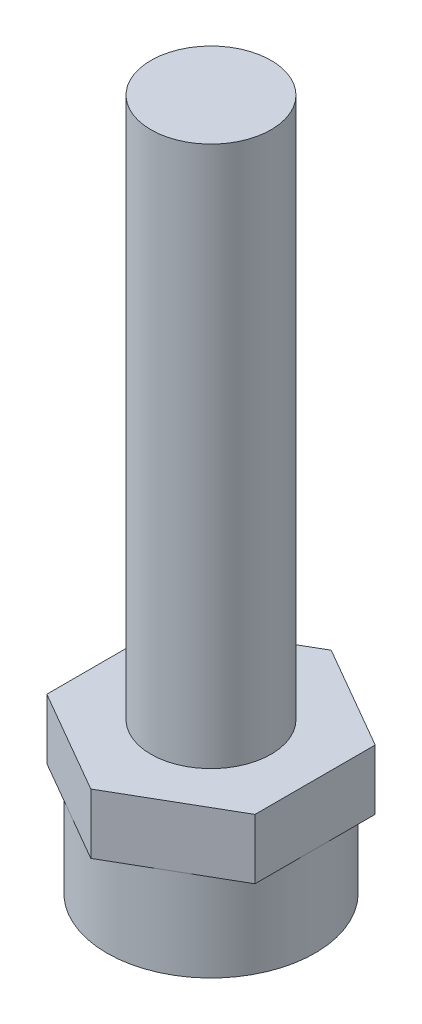
ISO-10303-21;
HEADER;
FILE_DESCRIPTION(('STEP AP214'),'2;1');
FILE_NAME('part.step','',(''),(''),'','','');
FILE_SCHEMA(('AUTOMOTIVE_DESIGN { 1 0 10303 214 1 1 1 1 }'));
ENDSEC;
DATA;
#1=APPLICATION_CONTEXT('core data for automotive mechanical design processes');
#2=APPLICATION_PROTOCOL_DEFINITION('international standard','automotive_design',2000,#1);
#3=PRODUCT_CONTEXT('',#1,'mechanical');
#4=PRODUCT('Part','Part','',(#3));
#5=PRODUCT_RELATED_PRODUCT_CATEGORY('part','',(#4));
#6=PRODUCT_DEFINITION_FORMATION('','',#4);
#7=PRODUCT_DEFINITION_CONTEXT('part definition',#1,'design');
#8=PRODUCT_DEFINITION('design','',#6,#7);
#9=PRODUCT_DEFINITION_SHAPE('','',#8);
#10=(LENGTH_UNIT() NAMED_UNIT(*) SI_UNIT(.MILLI.,.METRE.));
#11=(NAMED_UNIT(*) PLANE_ANGLE_UNIT() SI_UNIT($,.RADIAN.));
#12=(NAMED_UNIT(*) SI_UNIT($,.STERADIAN.) SOLID_ANGLE_UNIT());
#13=UNCERTAINTY_MEASURE_WITH_UNIT(LENGTH_MEASURE(1.E-05),#10,'distance_accuracy_value','');
#14=(GEOMETRIC_REPRESENTATION_CONTEXT(3) GLOBAL_UNCERTAINTY_ASSIGNED_CONTEXT((#13)) GLOBAL_UNIT_ASSIGNED_CONTEXT((#10,
#11,#12)) REPRESENTATION_CONTEXT('',''));
#15=CARTESIAN_POINT('',(0.,0.,0.));
#16=DIRECTION('',(0.,0.,1.));
#17=DIRECTION('',(1.,0.,0.));
#18=AXIS2_PLACEMENT_3D('',#15,#16,#17);
#19=CARTESIAN_POINT('',(0.866025403784438,1.,-1.5));
#20=DIRECTION('',(-0.5,0.,0.866025403784439));
#21=DIRECTION('',(0.866025403784439,0.,0.5));
#22=AXIS2_PLACEMENT_3D('',#19,#20,#21);
#23=PLANE('',#22);
#24=DIRECTION('',(-0.866025403784439,0.,-0.5));
#25=VECTOR('',#24,1.);
#26=CARTESIAN_POINT('',(0.866025403784438,0.,-1.5));
#27=LINE('',#26,#25);
#28=CARTESIAN_POINT('',(1.73205080756888,0.,-1.));
#29=VERTEX_POINT('',#28);
#30=CARTESIAN_POINT('',(0.,0.,-2.));
#31=VERTEX_POINT('',#30);
#32=EDGE_CURVE('E140',#29,#31,#27,.T.);
#33=ORIENTED_EDGE('',*,*,#32,.T.);
#34=DIRECTION('',(0.,-1.,0.));
#35=VECTOR('',#34,1.);
#36=CARTESIAN_POINT('',(0.,1.,-2.));
#37=LINE('',#36,#35);
#38=CARTESIAN_POINT('',(0.,1.,-2.));
#39=VERTEX_POINT('',#38);
#40=EDGE_CURVE('E12',#39,#31,#37,.T.);
#41=ORIENTED_EDGE('',*,*,#40,.F.);
#42=DIRECTION('',(-0.866025403784439,0.,-0.5));
#43=VECTOR('',#42,1.);
#44=CARTESIAN_POINT('',(0.866025403784438,1.,-1.5));
#45=LINE('',#44,#43);
#46=CARTESIAN_POINT('',(1.73205080756888,1.,-1.));
#47=VERTEX_POINT('',#46);
#48=EDGE_CURVE('E153',#47,#39,#45,.T.);
#49=ORIENTED_EDGE('',*,*,#48,.F.);
#50=DIRECTION('',(0.,-1.,0.));
#51=VECTOR('',#50,1.);
#52=CARTESIAN_POINT('',(1.73205080756888,1.,-1.));
#53=LINE('',#52,#51);
#54=EDGE_CURVE('E139',#47,#29,#53,.T.);
#55=ORIENTED_EDGE('',*,*,#54,.T.);
#56=EDGE_LOOP('',(#33,#41,#49,#55));
#57=FACE_BOUND('',#56,.T.);
#58=ADVANCED_FACE('F52',(#57),#23,.F.);
#59=CARTESIAN_POINT('',(-0.866025403784438,1.,-1.5));
#60=DIRECTION('',(0.5,0.,0.866025403784439));
#61=DIRECTION('',(0.866025403784439,0.,-0.5));
#62=AXIS2_PLACEMENT_3D('',#59,#60,#61);
#63=PLANE('',#62);
#64=DIRECTION('',(-0.866025403784439,0.,0.5));
#65=VECTOR('',#64,1.);
#66=CARTESIAN_POINT('',(-0.866025403784438,0.,-1.5));
#67=LINE('',#66,#65);
#68=CARTESIAN_POINT('',(-1.73205080756888,0.,-1.));
#69=VERTEX_POINT('',#68);
#70=EDGE_CURVE('E143',#31,#69,#67,.T.);
#71=ORIENTED_EDGE('',*,*,#70,.T.);
#72=DIRECTION('',(0.,-1.,0.));
#73=VECTOR('',#72,1.);
#74=CARTESIAN_POINT('',(-1.73205080756888,1.,-1.));
#75=LINE('',#74,#73);
#76=CARTESIAN_POINT('',(-1.73205080756888,1.,-1.));
#77=VERTEX_POINT('',#76);
#78=EDGE_CURVE('E60',#77,#69,#75,.T.);
#79=ORIENTED_EDGE('',*,*,#78,.F.);
#80=DIRECTION('',(-0.866025403784439,0.,0.5));
#81=VECTOR('',#80,1.);
#82=CARTESIAN_POINT('',(-0.866025403784438,1.,-1.5));
#83=LINE('',#82,#81);
#84=EDGE_CURVE('E105',#39,#77,#83,.T.);
#85=ORIENTED_EDGE('',*,*,#84,.F.);
#86=ORIENTED_EDGE('',*,*,#40,.T.);
#87=EDGE_LOOP('',(#71,#79,#85,#86));
#88=FACE_BOUND('',#87,.T.);
#89=ADVANCED_FACE('F179',(#88),#63,.F.);
#90=CARTESIAN_POINT('',(-1.73205080756888,1.,0.));
#91=DIRECTION('',(1.,0.,0.));
#92=DIRECTION('',(0.,0.,-1.));
#93=AXIS2_PLACEMENT_3D('',#90,#91,#92);
#94=PLANE('',#93);
#95=DIRECTION('',(0.,0.,1.));
#96=VECTOR('',#95,1.);
#97=CARTESIAN_POINT('',(-1.73205080756888,0.,0.));
#98=LINE('',#97,#96);
#99=CARTESIAN_POINT('',(-1.73205080756888,0.,1.));
#100=VERTEX_POINT('',#99);
#101=EDGE_CURVE('E145',#69,#100,#98,.T.);
#102=ORIENTED_EDGE('',*,*,#101,.T.);
#103=DIRECTION('',(0.,-1.,0.));
#104=VECTOR('',#103,1.);
#105=CARTESIAN_POINT('',(-1.73205080756888,1.,1.));
#106=LINE('',#105,#104);
#107=CARTESIAN_POINT('',(-1.73205080756888,1.,1.));
#108=VERTEX_POINT('',#107);
#109=EDGE_CURVE('E128',#108,#100,#106,.T.);
#110=ORIENTED_EDGE('',*,*,#109,.F.);
#111=DIRECTION('',(0.,0.,1.));
#112=VECTOR('',#111,1.);
#113=CARTESIAN_POINT('',(-1.73205080756888,1.,0.));
#114=LINE('',#113,#112);
#115=EDGE_CURVE('E119',#77,#108,#114,.T.);
#116=ORIENTED_EDGE('',*,*,#115,.F.);
#117=ORIENTED_EDGE('',*,*,#78,.T.);
#118=EDGE_LOOP('',(#102,#110,#116,#117));
#119=FACE_BOUND('',#118,.T.);
#120=ADVANCED_FACE('F159',(#119),#94,.F.);
#121=CARTESIAN_POINT('',(-0.866025403784439,1.,1.5));
#122=DIRECTION('',(0.5,0.,-0.866025403784439));
#123=DIRECTION('',(-0.866025403784439,0.,-0.5));
#124=AXIS2_PLACEMENT_3D('',#121,#122,#123);
#125=PLANE('',#124);
#126=DIRECTION('',(0.866025403784439,0.,0.5));
#127=VECTOR('',#126,1.);
#128=CARTESIAN_POINT('',(-0.866025403784439,0.,1.5));
#129=LINE('',#128,#127);
#130=CARTESIAN_POINT('',(0.,0.,2.));
#131=VERTEX_POINT('',#130);
#132=EDGE_CURVE('E127',#100,#131,#129,.T.);
#133=ORIENTED_EDGE('',*,*,#132,.T.);
#134=DIRECTION('',(0.,-1.,0.));
#135=VECTOR('',#134,1.);
#136=CARTESIAN_POINT('',(0.,1.,2.));
#137=LINE('',#136,#135);
#138=CARTESIAN_POINT('',(0.,1.,2.));
#139=VERTEX_POINT('',#138);
#140=EDGE_CURVE('E124',#139,#131,#137,.T.);
#141=ORIENTED_EDGE('',*,*,#140,.F.);
#142=DIRECTION('',(0.866025403784439,0.,0.5));
#143=VECTOR('',#142,1.);
#144=CARTESIAN_POINT('',(-0.866025403784439,1.,1.5));
#145=LINE('',#144,#143);
#146=EDGE_CURVE('E112',#108,#139,#145,.T.);
#147=ORIENTED_EDGE('',*,*,#146,.F.);
#148=ORIENTED_EDGE('',*,*,#109,.T.);
#149=EDGE_LOOP('',(#133,#141,#147,#148));
#150=FACE_BOUND('',#149,.T.);
#151=ADVANCED_FACE('F125',(#150),#125,.F.);
#152=CARTESIAN_POINT('',(0.866025403784438,1.,1.5));
#153=DIRECTION('',(-0.5,0.,-0.866025403784439));
#154=DIRECTION('',(-0.866025403784439,0.,0.5));
#155=AXIS2_PLACEMENT_3D('',#152,#153,#154);
#156=PLANE('',#155);
#157=DIRECTION('',(0.866025403784439,0.,-0.5));
#158=VECTOR('',#157,1.);
#159=CARTESIAN_POINT('',(0.866025403784438,0.,1.5));
#160=LINE('',#159,#158);
#161=CARTESIAN_POINT('',(1.73205080756888,0.,1.));
#162=VERTEX_POINT('',#161);
#163=EDGE_CURVE('E91',#131,#162,#160,.T.);
#164=ORIENTED_EDGE('',*,*,#163,.T.);
#165=DIRECTION('',(0.,-1.,0.));
#166=VECTOR('',#165,1.);
#167=CARTESIAN_POINT('',(1.73205080756888,1.,1.));
#168=LINE('',#167,#166);
#169=CARTESIAN_POINT('',(1.73205080756888,1.,1.));
#170=VERTEX_POINT('',#169);
#171=EDGE_CURVE('E129',#170,#162,#168,.T.);
#172=ORIENTED_EDGE('',*,*,#171,.F.);
#173=DIRECTION('',(0.866025403784439,0.,-0.5));
#174=VECTOR('',#173,1.);
#175=CARTESIAN_POINT('',(0.866025403784438,1.,1.5));
#176=LINE('',#175,#174);
#177=EDGE_CURVE('E117',#139,#170,#176,.T.);
#178=ORIENTED_EDGE('',*,*,#177,.F.);
#179=ORIENTED_EDGE('',*,*,#140,.T.);
#180=EDGE_LOOP('',(#164,#172,#178,#179));
#181=FACE_BOUND('',#180,.T.);
#182=ADVANCED_FACE('F131',(#181),#156,.F.);
#183=CARTESIAN_POINT('',(1.73205080756888,1.,0.));
#184=DIRECTION('',(-1.,0.,0.));
#185=DIRECTION('',(0.,0.,1.));
#186=AXIS2_PLACEMENT_3D('',#183,#184,#185);
#187=PLANE('',#186);
#188=DIRECTION('',(0.,0.,-1.));
#189=VECTOR('',#188,1.);
#190=CARTESIAN_POINT('',(1.73205080756888,0.,0.));
#191=LINE('',#190,#189);
#192=EDGE_CURVE('E97',#162,#29,#191,.T.);
#193=ORIENTED_EDGE('',*,*,#192,.T.);
#194=ORIENTED_EDGE('',*,*,#54,.F.);
#195=DIRECTION('',(0.,0.,-1.));
#196=VECTOR('',#195,1.);
#197=CARTESIAN_POINT('',(1.73205080756888,1.,0.));
#198=LINE('',#197,#196);
#199=EDGE_CURVE('E68',#170,#47,#198,.T.);
#200=ORIENTED_EDGE('',*,*,#199,.F.);
#201=ORIENTED_EDGE('',*,*,#171,.T.);
#202=EDGE_LOOP('',(#193,#194,#200,#201));
#203=FACE_BOUND('',#202,.T.);
#204=ADVANCED_FACE('F167',(#203),#187,.F.);
#205=CARTESIAN_POINT('',(0.,1.,0.));
#206=DIRECTION('',(0.,-1.,0.));
#207=DIRECTION('',(0.,0.,-1.));
#208=AXIS2_PLACEMENT_3D('',#205,#206,#207);
#209=CYLINDRICAL_SURFACE('',#208,1.);
#210=CARTESIAN_POINT('',(0.,1.,0.));
#211=DIRECTION('',(0.,1.,0.));
#212=DIRECTION('',(0.,0.,1.));
#213=AXIS2_PLACEMENT_3D('',#210,#211,#212);
#214=CIRCLE('',#213,1.);
#215=CARTESIAN_POINT('',(0.,1.,1.));
#216=VERTEX_POINT('',#215);
#217=EDGE_CURVE('E133',#216,#216,#214,.T.);
#218=ORIENTED_EDGE('',*,*,#217,.T.);
#219=EDGE_LOOP('',(#218));
#220=FACE_BOUND('',#219,.T.);
#221=CARTESIAN_POINT('',(0.,0.,0.));
#222=DIRECTION('',(0.,1.,0.));
#223=DIRECTION('',(0.,0.,1.));
#224=AXIS2_PLACEMENT_3D('',#221,#222,#223);
#225=CIRCLE('',#224,1.);
#226=CARTESIAN_POINT('',(0.,0.,1.));
#227=VERTEX_POINT('',#226);
#228=EDGE_CURVE('E150',#227,#227,#225,.T.);
#229=ORIENTED_EDGE('',*,*,#228,.F.);
#230=EDGE_LOOP('',(#229));
#231=FACE_BOUND('',#230,.T.);
#232=ADVANCED_FACE('F169',(#220,#231),#209,.F.);
#233=CARTESIAN_POINT('',(0.,1.,0.));
#234=DIRECTION('',(0.,1.,0.));
#235=DIRECTION('',(0.,0.,1.));
#236=AXIS2_PLACEMENT_3D('',#233,#234,#235);
#237=PLANE('',#236);
#238=ORIENTED_EDGE('',*,*,#48,.T.);
#239=ORIENTED_EDGE('',*,*,#84,.T.);
#240=ORIENTED_EDGE('',*,*,#115,.T.);
#241=ORIENTED_EDGE('',*,*,#146,.T.);
#242=ORIENTED_EDGE('',*,*,#177,.T.);
#243=ORIENTED_EDGE('',*,*,#199,.T.);
#244=EDGE_LOOP('',(#238,#239,#240,#241,#242,#243));
#245=FACE_BOUND('',#244,.T.);
#246=ORIENTED_EDGE('',*,*,#217,.F.);
#247=EDGE_LOOP('',(#246));
#248=FACE_BOUND('',#247,.T.);
#249=ADVANCED_FACE('F114',(#245,#248),#237,.T.);
#250=CARTESIAN_POINT('',(0.,0.,0.));
#251=DIRECTION('',(0.,1.,0.));
#252=DIRECTION('',(0.,0.,1.));
#253=AXIS2_PLACEMENT_3D('',#250,#251,#252);
#254=PLANE('',#253);
#255=ORIENTED_EDGE('',*,*,#32,.F.);
#256=ORIENTED_EDGE('',*,*,#192,.F.);
#257=ORIENTED_EDGE('',*,*,#163,.F.);
#258=ORIENTED_EDGE('',*,*,#132,.F.);
#259=ORIENTED_EDGE('',*,*,#101,.F.);
#260=ORIENTED_EDGE('',*,*,#70,.F.);
#261=EDGE_LOOP('',(#255,#256,#257,#258,#259,#260));
#262=FACE_BOUND('',#261,.T.);
#263=ORIENTED_EDGE('',*,*,#228,.T.);
#264=EDGE_LOOP('',(#263));
#265=FACE_BOUND('',#264,.T.);
#266=ADVANCED_FACE('F162',(#262,#265),#254,.F.);
#267=CLOSED_SHELL('',(#58,#89,#120,#151,#182,#204,#232,#249,#266));
#268=MANIFOLD_SOLID_BREP('B2',#267);
#269=CARTESIAN_POINT('',(0.,10.,0.));
#270=DIRECTION('',(0.,-1.,0.));
#271=DIRECTION('',(0.,0.,-1.));
#272=AXIS2_PLACEMENT_3D('',#269,#270,#271);
#273=CYLINDRICAL_SURFACE('',#272,1.);
#274=CARTESIAN_POINT('',(0.,10.,0.));
#275=DIRECTION('',(0.,1.,0.));
#276=DIRECTION('',(0.,0.,1.));
#277=AXIS2_PLACEMENT_3D('',#274,#275,#276);
#278=CIRCLE('',#277,1.);
#279=CARTESIAN_POINT('',(0.,10.,1.));
#280=VERTEX_POINT('',#279);
#281=EDGE_CURVE('E51',#280,#280,#278,.T.);
#282=ORIENTED_EDGE('',*,*,#281,.F.);
#283=EDGE_LOOP('',(#282));
#284=FACE_BOUND('',#283,.T.);
#285=CARTESIAN_POINT('',(0.,0.,0.));
#286=DIRECTION('',(0.,1.,0.));
#287=DIRECTION('',(0.,0.,1.));
#288=AXIS2_PLACEMENT_3D('',#285,#286,#287);
#289=CIRCLE('',#288,1.);
#290=CARTESIAN_POINT('',(0.,0.,1.));
#291=VERTEX_POINT('',#290);
#292=EDGE_CURVE('E293',#291,#291,#289,.T.);
#293=ORIENTED_EDGE('',*,*,#292,.T.);
#294=EDGE_LOOP('',(#293));
#295=FACE_BOUND('',#294,.T.);
#296=ADVANCED_FACE('F290',(#284,#295),#273,.T.);
#297=CARTESIAN_POINT('',(0.,10.,0.));
#298=DIRECTION('',(0.,1.,0.));
#299=DIRECTION('',(0.,0.,1.));
#300=AXIS2_PLACEMENT_3D('',#297,#298,#299);
#301=PLANE('',#300);
#302=ORIENTED_EDGE('',*,*,#281,.T.);
#303=EDGE_LOOP('',(#302));
#304=FACE_BOUND('',#303,.T.);
#305=ADVANCED_FACE('F325',(#304),#301,.T.);
#306=CARTESIAN_POINT('',(0.,-1.5,0.));
#307=DIRECTION('',(0.,1.,0.));
#308=DIRECTION('',(0.,0.,1.));
#309=AXIS2_PLACEMENT_3D('',#306,#307,#308);
#310=CYLINDRICAL_SURFACE('',#309,1.73205080756888);
#311=CARTESIAN_POINT('',(0.,-1.5,0.));
#312=DIRECTION('',(0.,1.,0.));
#313=DIRECTION('',(0.,0.,1.));
#314=AXIS2_PLACEMENT_3D('',#311,#312,#313);
#315=CIRCLE('',#314,1.73205080756888);
#316=CARTESIAN_POINT('',(0.,-1.5,1.73205080756888));
#317=VERTEX_POINT('',#316);
#318=EDGE_CURVE('E302',#317,#317,#315,.T.);
#319=ORIENTED_EDGE('',*,*,#318,.T.);
#320=EDGE_LOOP('',(#319));
#321=FACE_BOUND('',#320,.T.);
#322=CARTESIAN_POINT('',(0.,0.,0.));
#323=DIRECTION('',(0.,1.,0.));
#324=DIRECTION('',(0.,0.,1.));
#325=AXIS2_PLACEMENT_3D('',#322,#323,#324);
#326=CIRCLE('',#325,1.73205080756888);
#327=CARTESIAN_POINT('',(0.,0.,1.73205080756888));
#328=VERTEX_POINT('',#327);
#329=EDGE_CURVE('E304',#328,#328,#326,.T.);
#330=ORIENTED_EDGE('',*,*,#329,.F.);
#331=EDGE_LOOP('',(#330));
#332=FACE_BOUND('',#331,.T.);
#333=ADVANCED_FACE('F312',(#321,#332),#310,.T.);
#334=CARTESIAN_POINT('',(0.,-1.5,0.));
#335=DIRECTION('',(0.,1.,0.));
#336=DIRECTION('',(0.,0.,1.));
#337=AXIS2_PLACEMENT_3D('',#334,#335,#336);
#338=PLANE('',#337);
#339=ORIENTED_EDGE('',*,*,#318,.F.);
#340=EDGE_LOOP('',(#339));
#341=FACE_BOUND('',#340,.T.);
#342=ADVANCED_FACE('F315',(#341),#338,.F.);
#343=CARTESIAN_POINT('',(0.,0.,0.));
#344=DIRECTION('',(0.,1.,0.));
#345=DIRECTION('',(0.,0.,1.));
#346=AXIS2_PLACEMENT_3D('',#343,#344,#345);
#347=PLANE('',#346);
#348=ORIENTED_EDGE('',*,*,#292,.F.);
#349=EDGE_LOOP('',(#348));
#350=FACE_BOUND('',#349,.T.);
#351=ORIENTED_EDGE('',*,*,#329,.T.);
#352=EDGE_LOOP('',(#351));
#353=FACE_BOUND('',#352,.T.);
#354=ADVANCED_FACE('F317',(#350,#353),#347,.T.);
#355=CLOSED_SHELL('',(#296,#305,#333,#342,#354));
#356=MANIFOLD_SOLID_BREP('B6',#355);
#357=ADVANCED_BREP_SHAPE_REPRESENTATION('',(#18,#268,#356),#14);
#358=SHAPE_DEFINITION_REPRESENTATION(#9,#357);
ENDSEC;
END-ISO-10303-21;
